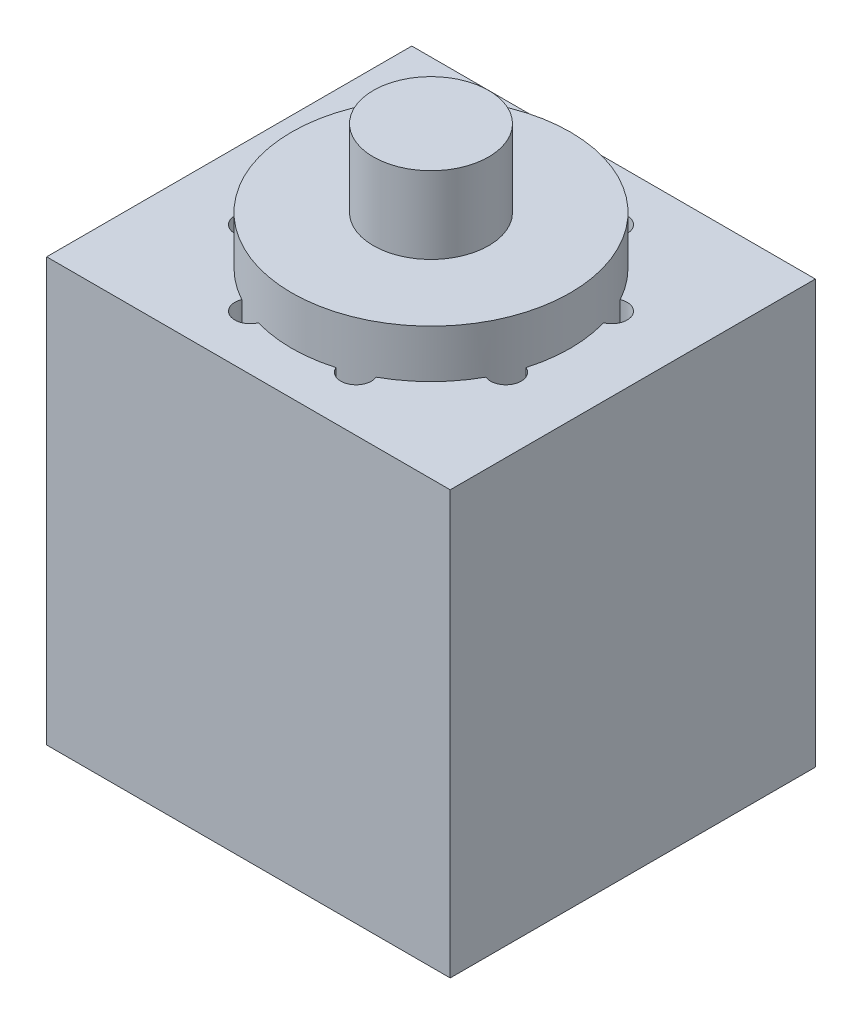
ISO-10303-21;
HEADER;
FILE_DESCRIPTION(('STEP AP214'),'2;1');
FILE_NAME('part.step','',(''),(''),'','','');
FILE_SCHEMA(('AUTOMOTIVE_DESIGN { 1 0 10303 214 1 1 1 1 }'));
ENDSEC;
DATA;
#1=APPLICATION_CONTEXT('core data for automotive mechanical design processes');
#2=APPLICATION_PROTOCOL_DEFINITION('international standard','automotive_design',2000,#1);
#3=PRODUCT_CONTEXT('',#1,'mechanical');
#4=PRODUCT('Part','Part','',(#3));
#5=PRODUCT_RELATED_PRODUCT_CATEGORY('part','',(#4));
#6=PRODUCT_DEFINITION_FORMATION('','',#4);
#7=PRODUCT_DEFINITION_CONTEXT('part definition',#1,'design');
#8=PRODUCT_DEFINITION('design','',#6,#7);
#9=PRODUCT_DEFINITION_SHAPE('','',#8);
#10=(LENGTH_UNIT() NAMED_UNIT(*) SI_UNIT(.MILLI.,.METRE.));
#11=(NAMED_UNIT(*) PLANE_ANGLE_UNIT() SI_UNIT($,.RADIAN.));
#12=(NAMED_UNIT(*) SI_UNIT($,.STERADIAN.) SOLID_ANGLE_UNIT());
#13=UNCERTAINTY_MEASURE_WITH_UNIT(LENGTH_MEASURE(1.E-05),#10,'distance_accuracy_value','');
#14=(GEOMETRIC_REPRESENTATION_CONTEXT(3) GLOBAL_UNCERTAINTY_ASSIGNED_CONTEXT((#13)) GLOBAL_UNIT_ASSIGNED_CONTEXT((#10,
#11,#12)) REPRESENTATION_CONTEXT('',''));
#15=CARTESIAN_POINT('',(0.,0.,0.));
#16=DIRECTION('',(0.,0.,1.));
#17=DIRECTION('',(1.,0.,0.));
#18=AXIS2_PLACEMENT_3D('',#15,#16,#17);
#19=CARTESIAN_POINT('',(66.5193263408126,220.,-27.5532071302865));
#20=DIRECTION('',(0.,-1.,0.));
#21=DIRECTION('',(0.,0.,-1.));
#22=AXIS2_PLACEMENT_3D('',#19,#20,#21);
#23=CYLINDRICAL_SURFACE('',#22,8.00000000000001);
#24=CARTESIAN_POINT('',(66.5193263408126,220.,-27.5532071302865));
#25=DIRECTION('',(0.,1.,0.));
#26=DIRECTION('',(0.,0.,1.));
#27=AXIS2_PLACEMENT_3D('',#24,#25,#26);
#28=CIRCLE('',#27,8.00000000000001);
#29=CARTESIAN_POINT('',(69.6336458909904,220.,-20.1842849744091));
#30=VERTEX_POINT('',#29);
#31=CARTESIAN_POINT('',(63.5108679870685,220.,-34.9659784294557));
#32=VERTEX_POINT('',#31);
#33=EDGE_CURVE('E249',#30,#32,#28,.T.);
#34=ORIENTED_EDGE('',*,*,#33,.T.);
#35=DIRECTION('',(0.,-1.,0.));
#36=VECTOR('',#35,1.);
#37=CARTESIAN_POINT('',(63.5108679870685,122.5,-34.9659784294557));
#38=LINE('',#37,#36);
#39=CARTESIAN_POINT('',(63.5108679870685,0.,-34.9659784294557));
#40=VERTEX_POINT('',#39);
#41=EDGE_CURVE('E331',#32,#40,#38,.T.);
#42=ORIENTED_EDGE('',*,*,#41,.T.);
#43=CARTESIAN_POINT('',(66.5193263408126,0.,-27.5532071302865));
#44=DIRECTION('',(0.,1.,0.));
#45=DIRECTION('',(0.,0.,1.));
#46=AXIS2_PLACEMENT_3D('',#43,#44,#45);
#47=CIRCLE('',#46,8.00000000000001);
#48=CARTESIAN_POINT('',(69.6336458909904,0.,-20.184284974409));
#49=VERTEX_POINT('',#48);
#50=EDGE_CURVE('E246',#49,#40,#47,.T.);
#51=ORIENTED_EDGE('',*,*,#50,.F.);
#52=DIRECTION('',(0.,-1.,0.));
#53=VECTOR('',#52,1.);
#54=CARTESIAN_POINT('',(69.6336458909904,122.5,-20.1842849744091));
#55=LINE('',#54,#53);
#56=EDGE_CURVE('E198',#49,#30,#55,.F.);
#57=ORIENTED_EDGE('',*,*,#56,.T.);
#58=EDGE_LOOP('',(#34,#42,#51,#57));
#59=FACE_BOUND('',#58,.T.);
#60=ADVANCED_FACE('F39',(#59),#23,.F.);
#61=CARTESIAN_POINT('',(27.5532071302865,220.,-66.5193263408126));
#62=DIRECTION('',(0.,-1.,0.));
#63=DIRECTION('',(0.,0.,-1.));
#64=AXIS2_PLACEMENT_3D('',#61,#62,#63);
#65=CYLINDRICAL_SURFACE('',#64,8.);
#66=CARTESIAN_POINT('',(27.5532071302865,220.,-66.5193263408126));
#67=DIRECTION('',(0.,1.,0.));
#68=DIRECTION('',(0.,0.,1.));
#69=AXIS2_PLACEMENT_3D('',#66,#67,#68);
#70=CIRCLE('',#69,8.);
#71=CARTESIAN_POINT('',(34.9659784294557,220.,-63.5108679870685));
#72=VERTEX_POINT('',#71);
#73=CARTESIAN_POINT('',(20.1842849744091,220.,-69.6336458909904));
#74=VERTEX_POINT('',#73);
#75=EDGE_CURVE('E243',#72,#74,#70,.T.);
#76=ORIENTED_EDGE('',*,*,#75,.T.);
#77=DIRECTION('',(0.,-1.,0.));
#78=VECTOR('',#77,1.);
#79=CARTESIAN_POINT('',(20.1842849744091,122.5,-69.6336458909904));
#80=LINE('',#79,#78);
#81=CARTESIAN_POINT('',(20.184284974409,0.,-69.6336458909904));
#82=VERTEX_POINT('',#81);
#83=EDGE_CURVE('E324',#74,#82,#80,.T.);
#84=ORIENTED_EDGE('',*,*,#83,.T.);
#85=CARTESIAN_POINT('',(27.5532071302865,0.,-66.5193263408126));
#86=DIRECTION('',(0.,1.,0.));
#87=DIRECTION('',(0.,0.,1.));
#88=AXIS2_PLACEMENT_3D('',#85,#86,#87);
#89=CIRCLE('',#88,8.);
#90=CARTESIAN_POINT('',(34.9659784294557,0.,-63.5108679870685));
#91=VERTEX_POINT('',#90);
#92=EDGE_CURVE('E240',#91,#82,#89,.T.);
#93=ORIENTED_EDGE('',*,*,#92,.F.);
#94=DIRECTION('',(0.,-1.,0.));
#95=VECTOR('',#94,1.);
#96=CARTESIAN_POINT('',(34.9659784294557,122.5,-63.5108679870685));
#97=LINE('',#96,#95);
#98=EDGE_CURVE('E328',#91,#72,#97,.F.);
#99=ORIENTED_EDGE('',*,*,#98,.T.);
#100=EDGE_LOOP('',(#76,#84,#93,#99));
#101=FACE_BOUND('',#100,.T.);
#102=ADVANCED_FACE('F396',(#101),#65,.F.);
#103=CARTESIAN_POINT('',(-27.5532071302865,220.,-66.5193263408126));
#104=DIRECTION('',(0.,-1.,0.));
#105=DIRECTION('',(0.,0.,-1.));
#106=AXIS2_PLACEMENT_3D('',#103,#104,#105);
#107=CYLINDRICAL_SURFACE('',#106,8.);
#108=CARTESIAN_POINT('',(-27.5532071302865,220.,-66.5193263408126));
#109=DIRECTION('',(0.,1.,0.));
#110=DIRECTION('',(0.,0.,1.));
#111=AXIS2_PLACEMENT_3D('',#108,#109,#110);
#112=CIRCLE('',#111,8.);
#113=CARTESIAN_POINT('',(-20.1842849744091,220.,-69.6336458909904));
#114=VERTEX_POINT('',#113);
#115=CARTESIAN_POINT('',(-34.9659784294557,220.,-63.5108679870685));
#116=VERTEX_POINT('',#115);
#117=EDGE_CURVE('E237',#114,#116,#112,.T.);
#118=ORIENTED_EDGE('',*,*,#117,.T.);
#119=DIRECTION('',(0.,-1.,0.));
#120=VECTOR('',#119,1.);
#121=CARTESIAN_POINT('',(-34.9659784294557,122.5,-63.5108679870685));
#122=LINE('',#121,#120);
#123=CARTESIAN_POINT('',(-34.9659784294557,0.,-63.5108679870685));
#124=VERTEX_POINT('',#123);
#125=EDGE_CURVE('E317',#116,#124,#122,.T.);
#126=ORIENTED_EDGE('',*,*,#125,.T.);
#127=CARTESIAN_POINT('',(-27.5532071302865,0.,-66.5193263408126));
#128=DIRECTION('',(0.,1.,0.));
#129=DIRECTION('',(0.,0.,1.));
#130=AXIS2_PLACEMENT_3D('',#127,#128,#129);
#131=CIRCLE('',#130,8.);
#132=CARTESIAN_POINT('',(-20.184284974409,0.,-69.6336458909904));
#133=VERTEX_POINT('',#132);
#134=EDGE_CURVE('E234',#133,#124,#131,.T.);
#135=ORIENTED_EDGE('',*,*,#134,.F.);
#136=DIRECTION('',(0.,-1.,0.));
#137=VECTOR('',#136,1.);
#138=CARTESIAN_POINT('',(-20.1842849744091,122.5,-69.6336458909904));
#139=LINE('',#138,#137);
#140=EDGE_CURVE('E321',#133,#114,#139,.F.);
#141=ORIENTED_EDGE('',*,*,#140,.T.);
#142=EDGE_LOOP('',(#118,#126,#135,#141));
#143=FACE_BOUND('',#142,.T.);
#144=ADVANCED_FACE('F356',(#143),#107,.F.);
#145=CARTESIAN_POINT('',(-66.5193263408126,220.,-27.5532071302865));
#146=DIRECTION('',(0.,-1.,0.));
#147=DIRECTION('',(0.,0.,-1.));
#148=AXIS2_PLACEMENT_3D('',#145,#146,#147);
#149=CYLINDRICAL_SURFACE('',#148,8.);
#150=CARTESIAN_POINT('',(-66.5193263408126,220.,-27.5532071302865));
#151=DIRECTION('',(0.,1.,0.));
#152=DIRECTION('',(0.,0.,1.));
#153=AXIS2_PLACEMENT_3D('',#150,#151,#152);
#154=CIRCLE('',#153,8.);
#155=CARTESIAN_POINT('',(-63.5108679870685,220.,-34.9659784294557));
#156=VERTEX_POINT('',#155);
#157=CARTESIAN_POINT('',(-69.6336458909904,220.,-20.1842849744091));
#158=VERTEX_POINT('',#157);
#159=EDGE_CURVE('E231',#156,#158,#154,.T.);
#160=ORIENTED_EDGE('',*,*,#159,.T.);
#161=DIRECTION('',(0.,-1.,0.));
#162=VECTOR('',#161,1.);
#163=CARTESIAN_POINT('',(-69.6336458909904,122.5,-20.1842849744091));
#164=LINE('',#163,#162);
#165=CARTESIAN_POINT('',(-69.6336458909904,0.,-20.184284974409));
#166=VERTEX_POINT('',#165);
#167=EDGE_CURVE('E309',#158,#166,#164,.T.);
#168=ORIENTED_EDGE('',*,*,#167,.T.);
#169=CARTESIAN_POINT('',(-66.5193263408126,0.,-27.5532071302865));
#170=DIRECTION('',(0.,1.,0.));
#171=DIRECTION('',(0.,0.,1.));
#172=AXIS2_PLACEMENT_3D('',#169,#170,#171);
#173=CIRCLE('',#172,8.);
#174=CARTESIAN_POINT('',(-63.5108679870685,0.,-34.9659784294557));
#175=VERTEX_POINT('',#174);
#176=EDGE_CURVE('E228',#175,#166,#173,.T.);
#177=ORIENTED_EDGE('',*,*,#176,.F.);
#178=DIRECTION('',(0.,-1.,0.));
#179=VECTOR('',#178,1.);
#180=CARTESIAN_POINT('',(-63.5108679870685,122.5,-34.9659784294557));
#181=LINE('',#180,#179);
#182=EDGE_CURVE('E314',#175,#156,#181,.F.);
#183=ORIENTED_EDGE('',*,*,#182,.T.);
#184=EDGE_LOOP('',(#160,#168,#177,#183));
#185=FACE_BOUND('',#184,.T.);
#186=ADVANCED_FACE('F361',(#185),#149,.F.);
#187=CARTESIAN_POINT('',(-66.5193263408126,220.,27.5532071302865));
#188=DIRECTION('',(0.,-1.,0.));
#189=DIRECTION('',(0.,0.,-1.));
#190=AXIS2_PLACEMENT_3D('',#187,#188,#189);
#191=CYLINDRICAL_SURFACE('',#190,7.99999999999998);
#192=CARTESIAN_POINT('',(-66.5193263408126,220.,27.5532071302865));
#193=DIRECTION('',(0.,1.,0.));
#194=DIRECTION('',(0.,0.,1.));
#195=AXIS2_PLACEMENT_3D('',#192,#193,#194);
#196=CIRCLE('',#195,7.99999999999998);
#197=CARTESIAN_POINT('',(-69.6336458909904,220.,20.1842849744091));
#198=VERTEX_POINT('',#197);
#199=CARTESIAN_POINT('',(-63.5108679870685,220.,34.9659784294557));
#200=VERTEX_POINT('',#199);
#201=EDGE_CURVE('E225',#198,#200,#196,.T.);
#202=ORIENTED_EDGE('',*,*,#201,.T.);
#203=DIRECTION('',(0.,-1.,0.));
#204=VECTOR('',#203,1.);
#205=CARTESIAN_POINT('',(-63.5108679870685,122.5,34.9659784294557));
#206=LINE('',#205,#204);
#207=CARTESIAN_POINT('',(-63.5108679870685,0.,34.9659784294557));
#208=VERTEX_POINT('',#207);
#209=EDGE_CURVE('E301',#200,#208,#206,.T.);
#210=ORIENTED_EDGE('',*,*,#209,.T.);
#211=CARTESIAN_POINT('',(-66.5193263408126,0.,27.5532071302865));
#212=DIRECTION('',(0.,1.,0.));
#213=DIRECTION('',(0.,0.,1.));
#214=AXIS2_PLACEMENT_3D('',#211,#212,#213);
#215=CIRCLE('',#214,7.99999999999998);
#216=CARTESIAN_POINT('',(-69.6336458909904,0.,20.184284974409));
#217=VERTEX_POINT('',#216);
#218=EDGE_CURVE('E222',#217,#208,#215,.T.);
#219=ORIENTED_EDGE('',*,*,#218,.F.);
#220=DIRECTION('',(0.,-1.,0.));
#221=VECTOR('',#220,1.);
#222=CARTESIAN_POINT('',(-69.6336458909904,122.5,20.1842849744091));
#223=LINE('',#222,#221);
#224=EDGE_CURVE('E306',#217,#198,#223,.F.);
#225=ORIENTED_EDGE('',*,*,#224,.T.);
#226=EDGE_LOOP('',(#202,#210,#219,#225));
#227=FACE_BOUND('',#226,.T.);
#228=ADVANCED_FACE('F384',(#227),#191,.F.);
#229=CARTESIAN_POINT('',(-27.5532071302865,220.,66.5193263408127));
#230=DIRECTION('',(0.,-1.,0.));
#231=DIRECTION('',(0.,0.,-1.));
#232=AXIS2_PLACEMENT_3D('',#229,#230,#231);
#233=CYLINDRICAL_SURFACE('',#232,8.00000000000001);
#234=CARTESIAN_POINT('',(-27.5532071302865,220.,66.5193263408127));
#235=DIRECTION('',(0.,1.,0.));
#236=DIRECTION('',(0.,0.,1.));
#237=AXIS2_PLACEMENT_3D('',#234,#235,#236);
#238=CIRCLE('',#237,8.00000000000001);
#239=CARTESIAN_POINT('',(-34.9659784294557,220.,63.5108679870685));
#240=VERTEX_POINT('',#239);
#241=CARTESIAN_POINT('',(-20.184284974409,220.,69.6336458909904));
#242=VERTEX_POINT('',#241);
#243=EDGE_CURVE('E219',#240,#242,#238,.T.);
#244=ORIENTED_EDGE('',*,*,#243,.T.);
#245=DIRECTION('',(0.,-1.,0.));
#246=VECTOR('',#245,1.);
#247=CARTESIAN_POINT('',(-20.184284974409,122.5,69.6336458909904));
#248=LINE('',#247,#246);
#249=CARTESIAN_POINT('',(-20.184284974409,0.,69.6336458909904));
#250=VERTEX_POINT('',#249);
#251=EDGE_CURVE('E296',#242,#250,#248,.T.);
#252=ORIENTED_EDGE('',*,*,#251,.T.);
#253=CARTESIAN_POINT('',(-27.5532071302865,0.,66.5193263408127));
#254=DIRECTION('',(0.,1.,0.));
#255=DIRECTION('',(0.,0.,1.));
#256=AXIS2_PLACEMENT_3D('',#253,#254,#255);
#257=CIRCLE('',#256,8.00000000000001);
#258=CARTESIAN_POINT('',(-34.9659784294557,0.,63.5108679870685));
#259=VERTEX_POINT('',#258);
#260=EDGE_CURVE('E212',#259,#250,#257,.T.);
#261=ORIENTED_EDGE('',*,*,#260,.F.);
#262=DIRECTION('',(0.,-1.,0.));
#263=VECTOR('',#262,1.);
#264=CARTESIAN_POINT('',(-34.9659784294557,122.5,63.5108679870685));
#265=LINE('',#264,#263);
#266=EDGE_CURVE('E299',#259,#240,#265,.F.);
#267=ORIENTED_EDGE('',*,*,#266,.T.);
#268=EDGE_LOOP('',(#244,#252,#261,#267));
#269=FACE_BOUND('',#268,.T.);
#270=ADVANCED_FACE('F381',(#269),#233,.F.);
#271=CARTESIAN_POINT('',(27.5532071302865,220.,66.5193263408127));
#272=DIRECTION('',(0.,-1.,0.));
#273=DIRECTION('',(0.,0.,-1.));
#274=AXIS2_PLACEMENT_3D('',#271,#272,#273);
#275=CYLINDRICAL_SURFACE('',#274,8.00000000000001);
#276=CARTESIAN_POINT('',(27.5532071302865,220.,66.5193263408127));
#277=DIRECTION('',(0.,1.,0.));
#278=DIRECTION('',(0.,0.,1.));
#279=AXIS2_PLACEMENT_3D('',#276,#277,#278);
#280=CIRCLE('',#279,8.00000000000001);
#281=CARTESIAN_POINT('',(20.1842849744091,220.,69.6336458909904));
#282=VERTEX_POINT('',#281);
#283=CARTESIAN_POINT('',(34.9659784294557,220.,63.5108679870685));
#284=VERTEX_POINT('',#283);
#285=EDGE_CURVE('E209',#282,#284,#280,.T.);
#286=ORIENTED_EDGE('',*,*,#285,.T.);
#287=DIRECTION('',(0.,-1.,0.));
#288=VECTOR('',#287,1.);
#289=CARTESIAN_POINT('',(34.9659784294557,122.5,63.5108679870685));
#290=LINE('',#289,#288);
#291=CARTESIAN_POINT('',(34.9659784294557,0.,63.5108679870685));
#292=VERTEX_POINT('',#291);
#293=EDGE_CURVE('E208',#284,#292,#290,.T.);
#294=ORIENTED_EDGE('',*,*,#293,.T.);
#295=CARTESIAN_POINT('',(27.5532071302865,0.,66.5193263408127));
#296=DIRECTION('',(0.,1.,0.));
#297=DIRECTION('',(0.,0.,1.));
#298=AXIS2_PLACEMENT_3D('',#295,#296,#297);
#299=CIRCLE('',#298,8.00000000000001);
#300=CARTESIAN_POINT('',(20.184284974409,0.,69.6336458909904));
#301=VERTEX_POINT('',#300);
#302=EDGE_CURVE('E203',#301,#292,#299,.T.);
#303=ORIENTED_EDGE('',*,*,#302,.F.);
#304=DIRECTION('',(0.,-1.,0.));
#305=VECTOR('',#304,1.);
#306=CARTESIAN_POINT('',(20.1842849744091,122.5,69.6336458909904));
#307=LINE('',#306,#305);
#308=EDGE_CURVE('E186',#301,#282,#307,.F.);
#309=ORIENTED_EDGE('',*,*,#308,.T.);
#310=EDGE_LOOP('',(#286,#294,#303,#309));
#311=FACE_BOUND('',#310,.T.);
#312=ADVANCED_FACE('F207',(#311),#275,.F.);
#313=CARTESIAN_POINT('',(66.5193263408126,220.,27.5532071302865));
#314=DIRECTION('',(0.,-1.,0.));
#315=DIRECTION('',(0.,0.,-1.));
#316=AXIS2_PLACEMENT_3D('',#313,#314,#315);
#317=CYLINDRICAL_SURFACE('',#316,8.00000000000001);
#318=CARTESIAN_POINT('',(66.5193263408126,220.,27.5532071302865));
#319=DIRECTION('',(0.,1.,0.));
#320=DIRECTION('',(0.,0.,1.));
#321=AXIS2_PLACEMENT_3D('',#318,#319,#320);
#322=CIRCLE('',#321,8.00000000000001);
#323=CARTESIAN_POINT('',(63.5108679870685,220.,34.9659784294557));
#324=VERTEX_POINT('',#323);
#325=CARTESIAN_POINT('',(69.6336458909904,220.,20.1842849744091));
#326=VERTEX_POINT('',#325);
#327=EDGE_CURVE('E210',#324,#326,#322,.T.);
#328=ORIENTED_EDGE('',*,*,#327,.T.);
#329=DIRECTION('',(0.,-1.,0.));
#330=VECTOR('',#329,1.);
#331=CARTESIAN_POINT('',(69.6336458909904,122.5,20.1842849744091));
#332=LINE('',#331,#330);
#333=CARTESIAN_POINT('',(69.6336458909904,0.,20.184284974409));
#334=VERTEX_POINT('',#333);
#335=EDGE_CURVE('E11',#326,#334,#332,.T.);
#336=ORIENTED_EDGE('',*,*,#335,.T.);
#337=CARTESIAN_POINT('',(66.5193263408126,0.,27.5532071302865));
#338=DIRECTION('',(0.,1.,0.));
#339=DIRECTION('',(0.,0.,1.));
#340=AXIS2_PLACEMENT_3D('',#337,#338,#339);
#341=CIRCLE('',#340,8.00000000000001);
#342=CARTESIAN_POINT('',(63.5108679870685,0.,34.9659784294557));
#343=VERTEX_POINT('',#342);
#344=EDGE_CURVE('E215',#343,#334,#341,.T.);
#345=ORIENTED_EDGE('',*,*,#344,.F.);
#346=DIRECTION('',(0.,-1.,0.));
#347=VECTOR('',#346,1.);
#348=CARTESIAN_POINT('',(63.5108679870685,122.5,34.9659784294557));
#349=LINE('',#348,#347);
#350=EDGE_CURVE('E48',#343,#324,#349,.F.);
#351=ORIENTED_EDGE('',*,*,#350,.T.);
#352=EDGE_LOOP('',(#328,#336,#345,#351));
#353=FACE_BOUND('',#352,.T.);
#354=ADVANCED_FACE('F281',(#353),#317,.F.);
#355=CARTESIAN_POINT('',(0.,220.,0.));
#356=DIRECTION('',(0.,-1.,0.));
#357=DIRECTION('',(0.,0.,-1.));
#358=AXIS2_PLACEMENT_3D('',#355,#356,#357);
#359=PLANE('',#358);
#360=CARTESIAN_POINT('',(0.,220.,0.));
#361=DIRECTION('',(0.,-1.,0.));
#362=DIRECTION('',(0.,0.,-1.));
#363=AXIS2_PLACEMENT_3D('',#360,#361,#362);
#364=CIRCLE('',#363,72.5);
#365=EDGE_CURVE('E310',#116,#156,#364,.F.);
#366=ORIENTED_EDGE('',*,*,#365,.F.);
#367=ORIENTED_EDGE('',*,*,#117,.F.);
#368=EDGE_CURVE('E318',#74,#114,#364,.F.);
#369=ORIENTED_EDGE('',*,*,#368,.F.);
#370=ORIENTED_EDGE('',*,*,#75,.F.);
#371=EDGE_CURVE('E295',#32,#72,#364,.F.);
#372=ORIENTED_EDGE('',*,*,#371,.F.);
#373=ORIENTED_EDGE('',*,*,#33,.F.);
#374=EDGE_CURVE('E289',#326,#30,#364,.F.);
#375=ORIENTED_EDGE('',*,*,#374,.F.);
#376=ORIENTED_EDGE('',*,*,#327,.F.);
#377=EDGE_CURVE('E287',#284,#324,#364,.F.);
#378=ORIENTED_EDGE('',*,*,#377,.F.);
#379=ORIENTED_EDGE('',*,*,#285,.F.);
#380=EDGE_CURVE('E193',#242,#282,#364,.F.);
#381=ORIENTED_EDGE('',*,*,#380,.F.);
#382=ORIENTED_EDGE('',*,*,#243,.F.);
#383=EDGE_CURVE('E297',#200,#240,#364,.F.);
#384=ORIENTED_EDGE('',*,*,#383,.F.);
#385=ORIENTED_EDGE('',*,*,#201,.F.);
#386=EDGE_CURVE('E302',#158,#198,#364,.F.);
#387=ORIENTED_EDGE('',*,*,#386,.F.);
#388=ORIENTED_EDGE('',*,*,#159,.F.);
#389=EDGE_LOOP('',(#366,#367,#369,#370,#372,#373,#375,#376,#378,#379,#381,#382,#384,#385,#387,#388));
#390=FACE_BOUND('',#389,.T.);
#391=DIRECTION('',(0.,0.,-1.));
#392=VECTOR('',#391,1.);
#393=CARTESIAN_POINT('',(105.,220.,95.));
#394=LINE('',#393,#392);
#395=CARTESIAN_POINT('',(105.,220.,95.));
#396=VERTEX_POINT('',#395);
#397=CARTESIAN_POINT('',(105.,220.,-95.));
#398=VERTEX_POINT('',#397);
#399=EDGE_CURVE('E255',#396,#398,#394,.T.);
#400=ORIENTED_EDGE('',*,*,#399,.T.);
#401=DIRECTION('',(-1.,0.,0.));
#402=VECTOR('',#401,1.);
#403=CARTESIAN_POINT('',(-105.,220.,-95.));
#404=LINE('',#403,#402);
#405=CARTESIAN_POINT('',(-105.,220.,-95.));
#406=VERTEX_POINT('',#405);
#407=EDGE_CURVE('E92',#398,#406,#404,.T.);
#408=ORIENTED_EDGE('',*,*,#407,.T.);
#409=DIRECTION('',(0.,0.,1.));
#410=VECTOR('',#409,1.);
#411=CARTESIAN_POINT('',(-105.,220.,95.));
#412=LINE('',#411,#410);
#413=CARTESIAN_POINT('',(-105.,220.,95.));
#414=VERTEX_POINT('',#413);
#415=EDGE_CURVE('E258',#406,#414,#412,.T.);
#416=ORIENTED_EDGE('',*,*,#415,.T.);
#417=DIRECTION('',(1.,0.,0.));
#418=VECTOR('',#417,1.);
#419=CARTESIAN_POINT('',(-105.,220.,95.));
#420=LINE('',#419,#418);
#421=EDGE_CURVE('E63',#414,#396,#420,.T.);
#422=ORIENTED_EDGE('',*,*,#421,.T.);
#423=EDGE_LOOP('',(#400,#408,#416,#422));
#424=FACE_BOUND('',#423,.T.);
#425=ADVANCED_FACE('F286',(#390,#424),#359,.F.);
#426=CARTESIAN_POINT('',(0.,0.,0.));
#427=DIRECTION('',(0.,-1.,0.));
#428=DIRECTION('',(0.,0.,-1.));
#429=AXIS2_PLACEMENT_3D('',#426,#427,#428);
#430=PLANE('',#429);
#431=CARTESIAN_POINT('',(0.,0.,0.));
#432=DIRECTION('',(0.,1.,0.));
#433=DIRECTION('',(0.,0.,1.));
#434=AXIS2_PLACEMENT_3D('',#431,#432,#433);
#435=CIRCLE('',#434,72.5);
#436=EDGE_CURVE('E364',#175,#166,#435,.T.);
#437=ORIENTED_EDGE('',*,*,#436,.F.);
#438=ORIENTED_EDGE('',*,*,#176,.T.);
#439=EDGE_LOOP('',(#437,#438));
#440=FACE_BOUND('',#439,.T.);
#441=EDGE_CURVE('E366',#217,#208,#435,.T.);
#442=ORIENTED_EDGE('',*,*,#441,.F.);
#443=ORIENTED_EDGE('',*,*,#218,.T.);
#444=EDGE_LOOP('',(#442,#443));
#445=FACE_BOUND('',#444,.T.);
#446=EDGE_CURVE('E206',#259,#250,#435,.T.);
#447=ORIENTED_EDGE('',*,*,#446,.F.);
#448=ORIENTED_EDGE('',*,*,#260,.T.);
#449=EDGE_LOOP('',(#447,#448));
#450=FACE_BOUND('',#449,.T.);
#451=EDGE_CURVE('E190',#301,#292,#435,.T.);
#452=ORIENTED_EDGE('',*,*,#451,.F.);
#453=ORIENTED_EDGE('',*,*,#302,.T.);
#454=EDGE_LOOP('',(#452,#453));
#455=FACE_BOUND('',#454,.T.);
#456=EDGE_CURVE('E54',#343,#334,#435,.T.);
#457=ORIENTED_EDGE('',*,*,#456,.F.);
#458=ORIENTED_EDGE('',*,*,#344,.T.);
#459=EDGE_LOOP('',(#457,#458));
#460=FACE_BOUND('',#459,.T.);
#461=EDGE_CURVE('E345',#49,#40,#435,.T.);
#462=ORIENTED_EDGE('',*,*,#461,.F.);
#463=ORIENTED_EDGE('',*,*,#50,.T.);
#464=EDGE_LOOP('',(#462,#463));
#465=FACE_BOUND('',#464,.T.);
#466=EDGE_CURVE('E349',#91,#82,#435,.T.);
#467=ORIENTED_EDGE('',*,*,#466,.F.);
#468=ORIENTED_EDGE('',*,*,#92,.T.);
#469=EDGE_LOOP('',(#467,#468));
#470=FACE_BOUND('',#469,.T.);
#471=DIRECTION('',(0.,0.,-1.));
#472=VECTOR('',#471,1.);
#473=CARTESIAN_POINT('',(105.,0.,95.));
#474=LINE('',#473,#472);
#475=CARTESIAN_POINT('',(105.,0.,95.));
#476=VERTEX_POINT('',#475);
#477=CARTESIAN_POINT('',(105.,0.,-95.));
#478=VERTEX_POINT('',#477);
#479=EDGE_CURVE('E252',#476,#478,#474,.T.);
#480=ORIENTED_EDGE('',*,*,#479,.F.);
#481=DIRECTION('',(1.,0.,0.));
#482=VECTOR('',#481,1.);
#483=CARTESIAN_POINT('',(-105.,0.,95.));
#484=LINE('',#483,#482);
#485=CARTESIAN_POINT('',(-105.,0.,95.));
#486=VERTEX_POINT('',#485);
#487=EDGE_CURVE('E84',#486,#476,#484,.T.);
#488=ORIENTED_EDGE('',*,*,#487,.F.);
#489=DIRECTION('',(0.,0.,1.));
#490=VECTOR('',#489,1.);
#491=CARTESIAN_POINT('',(-105.,0.,95.));
#492=LINE('',#491,#490);
#493=CARTESIAN_POINT('',(-105.,0.,-95.));
#494=VERTEX_POINT('',#493);
#495=EDGE_CURVE('E266',#494,#486,#492,.T.);
#496=ORIENTED_EDGE('',*,*,#495,.F.);
#497=DIRECTION('',(-1.,0.,0.));
#498=VECTOR('',#497,1.);
#499=CARTESIAN_POINT('',(-105.,0.,-95.));
#500=LINE('',#499,#498);
#501=EDGE_CURVE('E264',#478,#494,#500,.T.);
#502=ORIENTED_EDGE('',*,*,#501,.F.);
#503=EDGE_LOOP('',(#480,#488,#496,#502));
#504=FACE_BOUND('',#503,.T.);
#505=ORIENTED_EDGE('',*,*,#134,.T.);
#506=EDGE_CURVE('E354',#133,#124,#435,.T.);
#507=ORIENTED_EDGE('',*,*,#506,.F.);
#508=EDGE_LOOP('',(#505,#507));
#509=FACE_BOUND('',#508,.T.);
#510=ADVANCED_FACE('F202',(#440,#445,#450,#455,#460,#465,#470,#504,#509),#430,.T.);
#511=CARTESIAN_POINT('',(105.,220.,95.));
#512=DIRECTION('',(-1.,0.,0.));
#513=DIRECTION('',(0.,0.,1.));
#514=AXIS2_PLACEMENT_3D('',#511,#512,#513);
#515=PLANE('',#514);
#516=ORIENTED_EDGE('',*,*,#479,.T.);
#517=DIRECTION('',(0.,-1.,0.));
#518=VECTOR('',#517,1.);
#519=CARTESIAN_POINT('',(105.,220.,-95.));
#520=LINE('',#519,#518);
#521=EDGE_CURVE('E275',#398,#478,#520,.T.);
#522=ORIENTED_EDGE('',*,*,#521,.F.);
#523=ORIENTED_EDGE('',*,*,#399,.F.);
#524=DIRECTION('',(0.,-1.,0.));
#525=VECTOR('',#524,1.);
#526=CARTESIAN_POINT('',(105.,220.,95.));
#527=LINE('',#526,#525);
#528=EDGE_CURVE('E261',#396,#476,#527,.T.);
#529=ORIENTED_EDGE('',*,*,#528,.T.);
#530=EDGE_LOOP('',(#516,#522,#523,#529));
#531=FACE_BOUND('',#530,.T.);
#532=ADVANCED_FACE('F41',(#531),#515,.F.);
#533=CARTESIAN_POINT('',(-105.,220.,-95.));
#534=DIRECTION('',(0.,0.,1.));
#535=DIRECTION('',(1.,0.,0.));
#536=AXIS2_PLACEMENT_3D('',#533,#534,#535);
#537=PLANE('',#536);
#538=ORIENTED_EDGE('',*,*,#501,.T.);
#539=DIRECTION('',(0.,-1.,0.));
#540=VECTOR('',#539,1.);
#541=CARTESIAN_POINT('',(-105.,220.,-95.));
#542=LINE('',#541,#540);
#543=EDGE_CURVE('E272',#406,#494,#542,.T.);
#544=ORIENTED_EDGE('',*,*,#543,.F.);
#545=ORIENTED_EDGE('',*,*,#407,.F.);
#546=ORIENTED_EDGE('',*,*,#521,.T.);
#547=EDGE_LOOP('',(#538,#544,#545,#546));
#548=FACE_BOUND('',#547,.T.);
#549=ADVANCED_FACE('F412',(#548),#537,.F.);
#550=CARTESIAN_POINT('',(-105.,220.,95.));
#551=DIRECTION('',(1.,0.,0.));
#552=DIRECTION('',(0.,0.,-1.));
#553=AXIS2_PLACEMENT_3D('',#550,#551,#552);
#554=PLANE('',#553);
#555=ORIENTED_EDGE('',*,*,#495,.T.);
#556=DIRECTION('',(0.,-1.,0.));
#557=VECTOR('',#556,1.);
#558=CARTESIAN_POINT('',(-105.,220.,95.));
#559=LINE('',#558,#557);
#560=EDGE_CURVE('E270',#414,#486,#559,.T.);
#561=ORIENTED_EDGE('',*,*,#560,.F.);
#562=ORIENTED_EDGE('',*,*,#415,.F.);
#563=ORIENTED_EDGE('',*,*,#543,.T.);
#564=EDGE_LOOP('',(#555,#561,#562,#563));
#565=FACE_BOUND('',#564,.T.);
#566=ADVANCED_FACE('F410',(#565),#554,.F.);
#567=CARTESIAN_POINT('',(-105.,220.,95.));
#568=DIRECTION('',(0.,0.,-1.));
#569=DIRECTION('',(-1.,0.,0.));
#570=AXIS2_PLACEMENT_3D('',#567,#568,#569);
#571=PLANE('',#570);
#572=ORIENTED_EDGE('',*,*,#487,.T.);
#573=ORIENTED_EDGE('',*,*,#528,.F.);
#574=ORIENTED_EDGE('',*,*,#421,.F.);
#575=ORIENTED_EDGE('',*,*,#560,.T.);
#576=EDGE_LOOP('',(#572,#573,#574,#575));
#577=FACE_BOUND('',#576,.T.);
#578=ADVANCED_FACE('F407',(#577),#571,.F.);
#579=CARTESIAN_POINT('',(0.,245.,0.));
#580=DIRECTION('',(0.,-1.,0.));
#581=DIRECTION('',(0.,0.,-1.));
#582=AXIS2_PLACEMENT_3D('',#579,#580,#581);
#583=CYLINDRICAL_SURFACE('',#582,72.5);
#584=ORIENTED_EDGE('',*,*,#41,.F.);
#585=ORIENTED_EDGE('',*,*,#371,.T.);
#586=ORIENTED_EDGE('',*,*,#98,.F.);
#587=ORIENTED_EDGE('',*,*,#466,.T.);
#588=ORIENTED_EDGE('',*,*,#83,.F.);
#589=ORIENTED_EDGE('',*,*,#368,.T.);
#590=ORIENTED_EDGE('',*,*,#140,.F.);
#591=ORIENTED_EDGE('',*,*,#506,.T.);
#592=ORIENTED_EDGE('',*,*,#125,.F.);
#593=ORIENTED_EDGE('',*,*,#365,.T.);
#594=ORIENTED_EDGE('',*,*,#182,.F.);
#595=ORIENTED_EDGE('',*,*,#436,.T.);
#596=ORIENTED_EDGE('',*,*,#167,.F.);
#597=ORIENTED_EDGE('',*,*,#386,.T.);
#598=ORIENTED_EDGE('',*,*,#224,.F.);
#599=ORIENTED_EDGE('',*,*,#441,.T.);
#600=ORIENTED_EDGE('',*,*,#209,.F.);
#601=ORIENTED_EDGE('',*,*,#383,.T.);
#602=ORIENTED_EDGE('',*,*,#266,.F.);
#603=ORIENTED_EDGE('',*,*,#446,.T.);
#604=ORIENTED_EDGE('',*,*,#251,.F.);
#605=ORIENTED_EDGE('',*,*,#380,.T.);
#606=ORIENTED_EDGE('',*,*,#308,.F.);
#607=ORIENTED_EDGE('',*,*,#451,.T.);
#608=ORIENTED_EDGE('',*,*,#293,.F.);
#609=ORIENTED_EDGE('',*,*,#377,.T.);
#610=ORIENTED_EDGE('',*,*,#350,.F.);
#611=ORIENTED_EDGE('',*,*,#456,.T.);
#612=ORIENTED_EDGE('',*,*,#335,.F.);
#613=ORIENTED_EDGE('',*,*,#374,.T.);
#614=ORIENTED_EDGE('',*,*,#56,.F.);
#615=ORIENTED_EDGE('',*,*,#461,.T.);
#616=EDGE_LOOP('',(#584,#585,#586,#587,#588,#589,#590,#591,#592,#593,#594,#595,#596,#597,#598,
#599,#600,#601,#602,#603,#604,#605,#606,#607,#608,#609,#610,#611,#612,#613,#614,#615));
#617=FACE_BOUND('',#616,.T.);
#618=CARTESIAN_POINT('',(0.,245.,0.));
#619=DIRECTION('',(0.,1.,0.));
#620=DIRECTION('',(0.,0.,1.));
#621=AXIS2_PLACEMENT_3D('',#618,#619,#620);
#622=CIRCLE('',#621,72.5);
#623=CARTESIAN_POINT('',(0.,245.,72.5));
#624=VERTEX_POINT('',#623);
#625=EDGE_CURVE('E204',#624,#624,#622,.T.);
#626=ORIENTED_EDGE('',*,*,#625,.F.);
#627=EDGE_LOOP('',(#626));
#628=FACE_BOUND('',#627,.T.);
#629=ADVANCED_FACE('F188',(#617,#628),#583,.T.);
#630=CARTESIAN_POINT('',(0.,245.,0.));
#631=DIRECTION('',(0.,1.,0.));
#632=DIRECTION('',(0.,0.,1.));
#633=AXIS2_PLACEMENT_3D('',#630,#631,#632);
#634=PLANE('',#633);
#635=CARTESIAN_POINT('',(0.,245.,0.));
#636=DIRECTION('',(0.,1.,0.));
#637=DIRECTION('',(0.,0.,1.));
#638=AXIS2_PLACEMENT_3D('',#635,#636,#637);
#639=CIRCLE('',#638,30.);
#640=CARTESIAN_POINT('',(0.,245.,30.));
#641=VERTEX_POINT('',#640);
#642=EDGE_CURVE('E43',#641,#641,#639,.F.);
#643=ORIENTED_EDGE('',*,*,#642,.T.);
#644=EDGE_LOOP('',(#643));
#645=FACE_BOUND('',#644,.T.);
#646=ORIENTED_EDGE('',*,*,#625,.T.);
#647=EDGE_LOOP('',(#646));
#648=FACE_BOUND('',#647,.T.);
#649=ADVANCED_FACE('F527',(#645,#648),#634,.T.);
#650=CARTESIAN_POINT('',(0.,285.,0.));
#651=DIRECTION('',(0.,-1.,0.));
#652=DIRECTION('',(0.,0.,-1.));
#653=AXIS2_PLACEMENT_3D('',#650,#651,#652);
#654=CYLINDRICAL_SURFACE('',#653,30.);
#655=ORIENTED_EDGE('',*,*,#642,.F.);
#656=EDGE_LOOP('',(#655));
#657=FACE_BOUND('',#656,.T.);
#658=CARTESIAN_POINT('',(0.,285.,0.));
#659=DIRECTION('',(0.,1.,0.));
#660=DIRECTION('',(0.,0.,1.));
#661=AXIS2_PLACEMENT_3D('',#658,#659,#660);
#662=CIRCLE('',#661,30.);
#663=CARTESIAN_POINT('',(0.,285.,30.));
#664=VERTEX_POINT('',#663);
#665=EDGE_CURVE('E370',#664,#664,#662,.T.);
#666=ORIENTED_EDGE('',*,*,#665,.F.);
#667=EDGE_LOOP('',(#666));
#668=FACE_BOUND('',#667,.T.);
#669=ADVANCED_FACE('F536',(#657,#668),#654,.T.);
#670=CARTESIAN_POINT('',(0.,285.,0.));
#671=DIRECTION('',(0.,1.,0.));
#672=DIRECTION('',(0.,0.,1.));
#673=AXIS2_PLACEMENT_3D('',#670,#671,#672);
#674=PLANE('',#673);
#675=ORIENTED_EDGE('',*,*,#665,.T.);
#676=EDGE_LOOP('',(#675));
#677=FACE_BOUND('',#676,.T.);
#678=ADVANCED_FACE('F546',(#677),#674,.T.);
#679=CLOSED_SHELL('',(#60,#102,#144,#186,#228,#270,#312,#354,#425,#510,#532,#549,#566,#578,#629,
#649,#669,#678));
#680=MANIFOLD_SOLID_BREP('B2',#679);
#681=ADVANCED_BREP_SHAPE_REPRESENTATION('',(#18,#680),#14);
#682=SHAPE_DEFINITION_REPRESENTATION(#9,#681);
ENDSEC;
END-ISO-10303-21;
